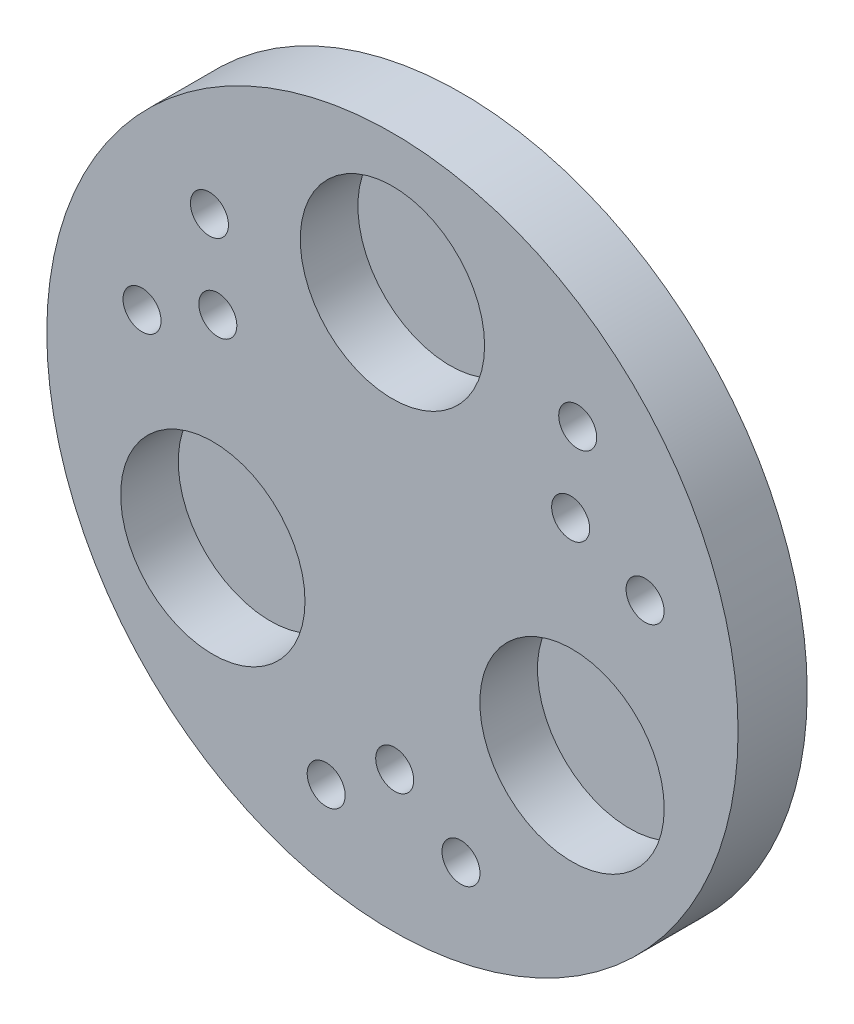
ISO-10303-21;
HEADER;
FILE_DESCRIPTION(('STEP AP214'),'2;1');
FILE_NAME('part.step','',(''),(''),'','','');
FILE_SCHEMA(('AUTOMOTIVE_DESIGN { 1 0 10303 214 1 1 1 1 }'));
ENDSEC;
DATA;
#1=APPLICATION_CONTEXT('core data for automotive mechanical design processes');
#2=APPLICATION_PROTOCOL_DEFINITION('international standard','automotive_design',2000,#1);
#3=PRODUCT_CONTEXT('',#1,'mechanical');
#4=PRODUCT('Part','Part','',(#3));
#5=PRODUCT_RELATED_PRODUCT_CATEGORY('part','',(#4));
#6=PRODUCT_DEFINITION_FORMATION('','',#4);
#7=PRODUCT_DEFINITION_CONTEXT('part definition',#1,'design');
#8=PRODUCT_DEFINITION('design','',#6,#7);
#9=PRODUCT_DEFINITION_SHAPE('','',#8);
#10=(LENGTH_UNIT() NAMED_UNIT(*) SI_UNIT(.MILLI.,.METRE.));
#11=(NAMED_UNIT(*) PLANE_ANGLE_UNIT() SI_UNIT($,.RADIAN.));
#12=(NAMED_UNIT(*) SI_UNIT($,.STERADIAN.) SOLID_ANGLE_UNIT());
#13=UNCERTAINTY_MEASURE_WITH_UNIT(LENGTH_MEASURE(1.E-05),#10,'distance_accuracy_value','');
#14=(GEOMETRIC_REPRESENTATION_CONTEXT(3) GLOBAL_UNCERTAINTY_ASSIGNED_CONTEXT((#13)) GLOBAL_UNIT_ASSIGNED_CONTEXT((#10,
#11,#12)) REPRESENTATION_CONTEXT('',''));
#15=CARTESIAN_POINT('',(0.,0.,0.));
#16=DIRECTION('',(0.,0.,1.));
#17=DIRECTION('',(1.,0.,0.));
#18=AXIS2_PLACEMENT_3D('',#15,#16,#17);
#19=CARTESIAN_POINT('',(0.,0.,2.5));
#20=DIRECTION('',(0.,0.,1.));
#21=DIRECTION('',(1.,0.,0.));
#22=AXIS2_PLACEMENT_3D('',#19,#20,#21);
#23=PLANE('',#22);
#24=CARTESIAN_POINT('',(-5.75102195285126,-21.8579228120305,2.5));
#25=DIRECTION('',(0.,0.,1.));
#26=DIRECTION('',(1.,0.,0.));
#27=AXIS2_PLACEMENT_3D('',#24,#25,#26);
#28=CIRCLE('',#27,1.64999999999999);
#29=CARTESIAN_POINT('',(-4.10102195285127,-21.8579228120305,2.5));
#30=VERTEX_POINT('',#29);
#31=EDGE_CURVE('E45',#30,#30,#28,.T.);
#32=ORIENTED_EDGE('',*,*,#31,.F.);
#33=EDGE_LOOP('',(#32));
#34=FACE_BOUND('',#33,.T.);
#35=CARTESIAN_POINT('',(5.94858039015673,-21.8577727189979,2.5));
#36=DIRECTION('',(0.,0.,1.));
#37=DIRECTION('',(1.,0.,0.));
#38=AXIS2_PLACEMENT_3D('',#35,#36,#37);
#39=CIRCLE('',#38,1.64999999999999);
#40=CARTESIAN_POINT('',(7.59858039015672,-21.8577727189979,2.5));
#41=VERTEX_POINT('',#40);
#42=EDGE_CURVE('E101',#41,#41,#39,.T.);
#43=ORIENTED_EDGE('',*,*,#42,.F.);
#44=EDGE_LOOP('',(#43));
#45=FACE_BOUND('',#44,.T.);
#46=CARTESIAN_POINT('',(21.9301792809536,5.82398866963032,2.5));
#47=DIRECTION('',(0.,0.,1.));
#48=DIRECTION('',(1.,0.,0.));
#49=AXIS2_PLACEMENT_3D('',#46,#47,#48);
#50=CIRCLE('',#49,1.64999999999999);
#51=CARTESIAN_POINT('',(23.5801792809536,5.82398866963032,2.5));
#52=VERTEX_POINT('',#51);
#53=EDGE_CURVE('E96',#52,#52,#50,.T.);
#54=ORIENTED_EDGE('',*,*,#53,.F.);
#55=EDGE_LOOP('',(#54));
#56=FACE_BOUND('',#55,.T.);
#57=CARTESIAN_POINT('',(16.0802481250705,15.9560664663349,2.5));
#58=DIRECTION('',(0.,0.,1.));
#59=DIRECTION('',(1.,0.,0.));
#60=AXIS2_PLACEMENT_3D('',#57,#58,#59);
#61=CIRCLE('',#60,1.64999999999999);
#62=CARTESIAN_POINT('',(17.7302481250704,15.9560664663349,2.5));
#63=VERTEX_POINT('',#62);
#64=EDGE_CURVE('E90',#63,#63,#61,.T.);
#65=ORIENTED_EDGE('',*,*,#64,.F.);
#66=EDGE_LOOP('',(#65));
#67=FACE_BOUND('',#66,.T.);
#68=CARTESIAN_POINT('',(-15.8836599043792,15.9556564045439,2.5));
#69=DIRECTION('',(0.,0.,1.));
#70=DIRECTION('',(1.,0.,0.));
#71=AXIS2_PLACEMENT_3D('',#68,#69,#70);
#72=CIRCLE('',#71,1.64999999999999);
#73=CARTESIAN_POINT('',(-14.2336599043793,15.9556564045439,2.5));
#74=VERTEX_POINT('',#73);
#75=EDGE_CURVE('E84',#74,#74,#72,.T.);
#76=ORIENTED_EDGE('',*,*,#75,.F.);
#77=EDGE_LOOP('',(#76));
#78=FACE_BOUND('',#77,.T.);
#79=CARTESIAN_POINT('',(0.196397149283782,-17.7474115865386,2.5));
#80=DIRECTION('',(0.,0.,1.));
#81=DIRECTION('',(1.,0.,0.));
#82=AXIS2_PLACEMENT_3D('',#79,#80,#81);
#83=CIRCLE('',#82,1.64999999999999);
#84=CARTESIAN_POINT('',(1.84639714928377,-17.7474115865386,2.5));
#85=VERTEX_POINT('',#84);
#86=EDGE_CURVE('E78',#85,#85,#83,.T.);
#87=ORIENTED_EDGE('',*,*,#86,.F.);
#88=EDGE_LOOP('',(#87));
#89=FACE_BOUND('',#88,.T.);
#90=CARTESIAN_POINT('',(15.4679078600027,8.79637912724138,2.5));
#91=DIRECTION('',(0.,0.,1.));
#92=DIRECTION('',(1.,0.,0.));
#93=AXIS2_PLACEMENT_3D('',#90,#91,#92);
#94=CIRCLE('',#93,1.64999999999999);
#95=CARTESIAN_POINT('',(17.1179078600027,8.79637912724138,2.5));
#96=VERTEX_POINT('',#95);
#97=EDGE_CURVE('E72',#96,#96,#94,.T.);
#98=ORIENTED_EDGE('',*,*,#97,.F.);
#99=EDGE_LOOP('',(#98));
#100=FACE_BOUND('',#99,.T.);
#101=CARTESIAN_POINT('',(-15.1554445662277,8.75000000000002,2.5));
#102=DIRECTION('',(0.,0.,1.));
#103=DIRECTION('',(1.,0.,0.));
#104=AXIS2_PLACEMENT_3D('',#101,#102,#103);
#105=CIRCLE('',#104,1.64999999999999);
#106=CARTESIAN_POINT('',(-13.5054445662277,8.75000000000002,2.5));
#107=VERTEX_POINT('',#106);
#108=EDGE_CURVE('E66',#107,#107,#105,.T.);
#109=ORIENTED_EDGE('',*,*,#108,.F.);
#110=EDGE_LOOP('',(#109));
#111=FACE_BOUND('',#110,.T.);
#112=CARTESIAN_POINT('',(-21.733331091504,5.82342851480674,2.5));
#113=DIRECTION('',(0.,0.,1.));
#114=DIRECTION('',(1.,0.,0.));
#115=AXIS2_PLACEMENT_3D('',#112,#113,#114);
#116=CIRCLE('',#115,1.64999999999999);
#117=CARTESIAN_POINT('',(-20.083331091504,5.82342851480674,2.5));
#118=VERTEX_POINT('',#117);
#119=EDGE_CURVE('E60',#118,#118,#116,.T.);
#120=ORIENTED_EDGE('',*,*,#119,.F.);
#121=EDGE_LOOP('',(#120));
#122=FACE_BOUND('',#121,.T.);
#123=CARTESIAN_POINT('',(15.5884572681213,-8.99999999999918,2.5));
#124=DIRECTION('',(0.,0.,1.));
#125=DIRECTION('',(1.,0.,0.));
#126=AXIS2_PLACEMENT_3D('',#123,#124,#125);
#127=CIRCLE('',#126,8.);
#128=CARTESIAN_POINT('',(23.5884572681213,-8.99999999999918,2.5));
#129=VERTEX_POINT('',#128);
#130=EDGE_CURVE('E173',#129,#129,#127,.T.);
#131=ORIENTED_EDGE('',*,*,#130,.F.);
#132=EDGE_LOOP('',(#131));
#133=FACE_BOUND('',#132,.T.);
#134=CARTESIAN_POINT('',(0.,0.,2.5));
#135=DIRECTION('',(0.,0.,1.));
#136=DIRECTION('',(1.,0.,0.));
#137=AXIS2_PLACEMENT_3D('',#134,#135,#136);
#138=CIRCLE('',#137,30.);
#139=CARTESIAN_POINT('',(30.,0.,2.5));
#140=VERTEX_POINT('',#139);
#141=EDGE_CURVE('E10',#140,#140,#138,.T.);
#142=ORIENTED_EDGE('',*,*,#141,.T.);
#143=EDGE_LOOP('',(#142));
#144=FACE_BOUND('',#143,.T.);
#145=CARTESIAN_POINT('',(0.,18.,2.5));
#146=DIRECTION('',(0.,0.,1.));
#147=DIRECTION('',(1.,0.,0.));
#148=AXIS2_PLACEMENT_3D('',#145,#146,#147);
#149=CIRCLE('',#148,8.);
#150=CARTESIAN_POINT('',(8.,18.,2.5));
#151=VERTEX_POINT('',#150);
#152=EDGE_CURVE('E50',#151,#151,#149,.T.);
#153=ORIENTED_EDGE('',*,*,#152,.F.);
#154=EDGE_LOOP('',(#153));
#155=FACE_BOUND('',#154,.T.);
#156=CARTESIAN_POINT('',(-15.5884572681185,-9.00000000000082,2.5));
#157=DIRECTION('',(0.,0.,1.));
#158=DIRECTION('',(1.,0.,0.));
#159=AXIS2_PLACEMENT_3D('',#156,#157,#158);
#160=CIRCLE('',#159,8.);
#161=CARTESIAN_POINT('',(-7.58845726811848,-9.00000000000082,2.5));
#162=VERTEX_POINT('',#161);
#163=EDGE_CURVE('E165',#162,#162,#160,.T.);
#164=ORIENTED_EDGE('',*,*,#163,.F.);
#165=EDGE_LOOP('',(#164));
#166=FACE_BOUND('',#165,.T.);
#167=ADVANCED_FACE('F41',(#34,#45,#56,#67,#78,#89,#100,#111,#122,#133,#144,#155,#166),#23,.T.);
#168=CARTESIAN_POINT('',(0.,0.,2.5));
#169=DIRECTION('',(0.,0.,-1.));
#170=DIRECTION('',(-1.,0.,0.));
#171=AXIS2_PLACEMENT_3D('',#168,#169,#170);
#172=CYLINDRICAL_SURFACE('',#171,30.);
#173=ORIENTED_EDGE('',*,*,#141,.F.);
#174=EDGE_LOOP('',(#173));
#175=FACE_BOUND('',#174,.T.);
#176=CARTESIAN_POINT('',(0.,0.,-3.5));
#177=DIRECTION('',(0.,0.,-1.));
#178=DIRECTION('',(-1.,0.,0.));
#179=AXIS2_PLACEMENT_3D('',#176,#177,#178);
#180=CIRCLE('',#179,30.);
#181=CARTESIAN_POINT('',(-30.,0.,-3.5));
#182=VERTEX_POINT('',#181);
#183=EDGE_CURVE('E64',#182,#182,#180,.T.);
#184=ORIENTED_EDGE('',*,*,#183,.F.);
#185=EDGE_LOOP('',(#184));
#186=FACE_BOUND('',#185,.T.);
#187=ADVANCED_FACE('F43',(#175,#186),#172,.T.);
#188=CARTESIAN_POINT('',(0.,18.,2.5));
#189=DIRECTION('',(0.,0.,-1.));
#190=DIRECTION('',(-1.,0.,0.));
#191=AXIS2_PLACEMENT_3D('',#188,#189,#190);
#192=CYLINDRICAL_SURFACE('',#191,8.);
#193=ORIENTED_EDGE('',*,*,#152,.T.);
#194=EDGE_LOOP('',(#193));
#195=FACE_BOUND('',#194,.T.);
#196=CARTESIAN_POINT('',(0.,18.,-2.5));
#197=DIRECTION('',(0.,0.,1.));
#198=DIRECTION('',(1.,0.,0.));
#199=AXIS2_PLACEMENT_3D('',#196,#197,#198);
#200=CIRCLE('',#199,8.);
#201=CARTESIAN_POINT('',(8.,18.,-2.5));
#202=VERTEX_POINT('',#201);
#203=EDGE_CURVE('E56',#202,#202,#200,.T.);
#204=ORIENTED_EDGE('',*,*,#203,.F.);
#205=EDGE_LOOP('',(#204));
#206=FACE_BOUND('',#205,.T.);
#207=ADVANCED_FACE('F186',(#195,#206),#192,.F.);
#208=CARTESIAN_POINT('',(15.5884572681213,-8.99999999999918,2.5));
#209=DIRECTION('',(0.,0.,-1.));
#210=DIRECTION('',(-1.,0.,0.));
#211=AXIS2_PLACEMENT_3D('',#208,#209,#210);
#212=CYLINDRICAL_SURFACE('',#211,8.);
#213=ORIENTED_EDGE('',*,*,#130,.T.);
#214=EDGE_LOOP('',(#213));
#215=FACE_BOUND('',#214,.T.);
#216=CARTESIAN_POINT('',(15.5884572681213,-8.99999999999918,-2.5));
#217=DIRECTION('',(0.,0.,1.));
#218=DIRECTION('',(1.,0.,0.));
#219=AXIS2_PLACEMENT_3D('',#216,#217,#218);
#220=CIRCLE('',#219,8.);
#221=CARTESIAN_POINT('',(23.5884572681213,-8.99999999999918,-2.5));
#222=VERTEX_POINT('',#221);
#223=EDGE_CURVE('E169',#222,#222,#220,.T.);
#224=ORIENTED_EDGE('',*,*,#223,.F.);
#225=EDGE_LOOP('',(#224));
#226=FACE_BOUND('',#225,.T.);
#227=ADVANCED_FACE('F183',(#215,#226),#212,.F.);
#228=CARTESIAN_POINT('',(-15.5884572681185,-9.00000000000082,2.5));
#229=DIRECTION('',(0.,0.,-1.));
#230=DIRECTION('',(-1.,0.,0.));
#231=AXIS2_PLACEMENT_3D('',#228,#229,#230);
#232=CYLINDRICAL_SURFACE('',#231,8.);
#233=ORIENTED_EDGE('',*,*,#163,.T.);
#234=EDGE_LOOP('',(#233));
#235=FACE_BOUND('',#234,.T.);
#236=CARTESIAN_POINT('',(-15.5884572681185,-9.00000000000082,-2.5));
#237=DIRECTION('',(0.,0.,1.));
#238=DIRECTION('',(1.,0.,0.));
#239=AXIS2_PLACEMENT_3D('',#236,#237,#238);
#240=CIRCLE('',#239,8.);
#241=CARTESIAN_POINT('',(-7.58845726811848,-9.00000000000082,-2.5));
#242=VERTEX_POINT('',#241);
#243=EDGE_CURVE('E164',#242,#242,#240,.T.);
#244=ORIENTED_EDGE('',*,*,#243,.F.);
#245=EDGE_LOOP('',(#244));
#246=FACE_BOUND('',#245,.T.);
#247=ADVANCED_FACE('F185',(#235,#246),#232,.F.);
#248=CARTESIAN_POINT('',(0.,0.,-2.5));
#249=DIRECTION('',(0.,0.,-1.));
#250=DIRECTION('',(-1.,0.,0.));
#251=AXIS2_PLACEMENT_3D('',#248,#249,#250);
#252=PLANE('',#251);
#253=ORIENTED_EDGE('',*,*,#243,.T.);
#254=EDGE_LOOP('',(#253));
#255=FACE_BOUND('',#254,.T.);
#256=ADVANCED_FACE('F193',(#255),#252,.F.);
#257=ORIENTED_EDGE('',*,*,#223,.T.);
#258=EDGE_LOOP('',(#257));
#259=FACE_BOUND('',#258,.T.);
#260=ADVANCED_FACE('F181',(#259),#252,.F.);
#261=ORIENTED_EDGE('',*,*,#203,.T.);
#262=EDGE_LOOP('',(#261));
#263=FACE_BOUND('',#262,.T.);
#264=ADVANCED_FACE('F232',(#263),#252,.F.);
#265=CARTESIAN_POINT('',(0.,0.,-3.5));
#266=DIRECTION('',(0.,0.,-1.));
#267=DIRECTION('',(-1.,0.,0.));
#268=AXIS2_PLACEMENT_3D('',#265,#266,#267);
#269=PLANE('',#268);
#270=CARTESIAN_POINT('',(-5.75102195285126,-21.8579228120305,-3.5));
#271=DIRECTION('',(0.,0.,-1.));
#272=DIRECTION('',(-1.,0.,0.));
#273=AXIS2_PLACEMENT_3D('',#270,#271,#272);
#274=CIRCLE('',#273,2.025);
#275=CARTESIAN_POINT('',(-7.77602195285126,-21.8579228120305,-3.5));
#276=VERTEX_POINT('',#275);
#277=EDGE_CURVE('E330',#276,#276,#274,.T.);
#278=ORIENTED_EDGE('',*,*,#277,.F.);
#279=EDGE_LOOP('',(#278));
#280=FACE_BOUND('',#279,.T.);
#281=CARTESIAN_POINT('',(5.94858039015673,-21.8577727189979,-3.5));
#282=DIRECTION('',(0.,0.,-1.));
#283=DIRECTION('',(-1.,0.,0.));
#284=AXIS2_PLACEMENT_3D('',#281,#282,#283);
#285=CIRCLE('',#284,2.025);
#286=CARTESIAN_POINT('',(3.92358039015673,-21.8577727189979,-3.5));
#287=VERTEX_POINT('',#286);
#288=EDGE_CURVE('E113',#287,#287,#285,.T.);
#289=ORIENTED_EDGE('',*,*,#288,.F.);
#290=EDGE_LOOP('',(#289));
#291=FACE_BOUND('',#290,.T.);
#292=CARTESIAN_POINT('',(21.9301792809536,5.82398866963032,-3.5));
#293=DIRECTION('',(0.,0.,-1.));
#294=DIRECTION('',(-1.,0.,0.));
#295=AXIS2_PLACEMENT_3D('',#292,#293,#294);
#296=CIRCLE('',#295,2.025);
#297=CARTESIAN_POINT('',(19.9051792809536,5.82398866963032,-3.5));
#298=VERTEX_POINT('',#297);
#299=EDGE_CURVE('E104',#298,#298,#296,.T.);
#300=ORIENTED_EDGE('',*,*,#299,.F.);
#301=EDGE_LOOP('',(#300));
#302=FACE_BOUND('',#301,.T.);
#303=CARTESIAN_POINT('',(16.0802481250705,15.9560664663349,-3.5));
#304=DIRECTION('',(0.,0.,-1.));
#305=DIRECTION('',(-1.,0.,0.));
#306=AXIS2_PLACEMENT_3D('',#303,#304,#305);
#307=CIRCLE('',#306,2.025);
#308=CARTESIAN_POINT('',(14.0552481250705,15.9560664663349,-3.5));
#309=VERTEX_POINT('',#308);
#310=EDGE_CURVE('E99',#309,#309,#307,.T.);
#311=ORIENTED_EDGE('',*,*,#310,.F.);
#312=EDGE_LOOP('',(#311));
#313=FACE_BOUND('',#312,.T.);
#314=CARTESIAN_POINT('',(-15.8836599043792,15.9556564045439,-3.5));
#315=DIRECTION('',(0.,0.,-1.));
#316=DIRECTION('',(-1.,0.,0.));
#317=AXIS2_PLACEMENT_3D('',#314,#315,#316);
#318=CIRCLE('',#317,2.025);
#319=CARTESIAN_POINT('',(-17.9086599043792,15.9556564045439,-3.5));
#320=VERTEX_POINT('',#319);
#321=EDGE_CURVE('E94',#320,#320,#318,.T.);
#322=ORIENTED_EDGE('',*,*,#321,.F.);
#323=EDGE_LOOP('',(#322));
#324=FACE_BOUND('',#323,.T.);
#325=CARTESIAN_POINT('',(0.196397149283782,-17.7474115865386,-3.5));
#326=DIRECTION('',(0.,0.,-1.));
#327=DIRECTION('',(-1.,0.,0.));
#328=AXIS2_PLACEMENT_3D('',#325,#326,#327);
#329=CIRCLE('',#328,2.025);
#330=CARTESIAN_POINT('',(-1.82860285071622,-17.7474115865386,-3.5));
#331=VERTEX_POINT('',#330);
#332=EDGE_CURVE('E88',#331,#331,#329,.T.);
#333=ORIENTED_EDGE('',*,*,#332,.F.);
#334=EDGE_LOOP('',(#333));
#335=FACE_BOUND('',#334,.T.);
#336=CARTESIAN_POINT('',(15.4679078600027,8.79637912724138,-3.5));
#337=DIRECTION('',(0.,0.,-1.));
#338=DIRECTION('',(-1.,0.,0.));
#339=AXIS2_PLACEMENT_3D('',#336,#337,#338);
#340=CIRCLE('',#339,2.025);
#341=CARTESIAN_POINT('',(13.4429078600027,8.79637912724138,-3.5));
#342=VERTEX_POINT('',#341);
#343=EDGE_CURVE('E82',#342,#342,#340,.T.);
#344=ORIENTED_EDGE('',*,*,#343,.F.);
#345=EDGE_LOOP('',(#344));
#346=FACE_BOUND('',#345,.T.);
#347=CARTESIAN_POINT('',(-15.1554445662277,8.75000000000002,-3.5));
#348=DIRECTION('',(0.,0.,-1.));
#349=DIRECTION('',(-1.,0.,0.));
#350=AXIS2_PLACEMENT_3D('',#347,#348,#349);
#351=CIRCLE('',#350,2.025);
#352=CARTESIAN_POINT('',(-17.1804445662277,8.75000000000002,-3.5));
#353=VERTEX_POINT('',#352);
#354=EDGE_CURVE('E76',#353,#353,#351,.T.);
#355=ORIENTED_EDGE('',*,*,#354,.F.);
#356=EDGE_LOOP('',(#355));
#357=FACE_BOUND('',#356,.T.);
#358=CARTESIAN_POINT('',(-21.733331091504,5.82342851480674,-3.5));
#359=DIRECTION('',(0.,0.,-1.));
#360=DIRECTION('',(-1.,0.,0.));
#361=AXIS2_PLACEMENT_3D('',#358,#359,#360);
#362=CIRCLE('',#361,2.025);
#363=CARTESIAN_POINT('',(-23.758331091504,5.82342851480674,-3.5));
#364=VERTEX_POINT('',#363);
#365=EDGE_CURVE('E70',#364,#364,#362,.T.);
#366=ORIENTED_EDGE('',*,*,#365,.F.);
#367=EDGE_LOOP('',(#366));
#368=FACE_BOUND('',#367,.T.);
#369=ORIENTED_EDGE('',*,*,#183,.T.);
#370=EDGE_LOOP('',(#369));
#371=FACE_BOUND('',#370,.T.);
#372=ADVANCED_FACE('F238',(#280,#291,#302,#313,#324,#335,#346,#357,#368,#371),#269,.T.);
#373=CARTESIAN_POINT('',(-21.733331091504,5.82342851480674,-3.5));
#374=DIRECTION('',(0.,0.,-1.));
#375=DIRECTION('',(-1.,0.,0.));
#376=AXIS2_PLACEMENT_3D('',#373,#374,#375);
#377=CYLINDRICAL_SURFACE('',#376,1.64999999999999);
#378=ORIENTED_EDGE('',*,*,#119,.T.);
#379=EDGE_LOOP('',(#378));
#380=FACE_BOUND('',#379,.T.);
#381=CARTESIAN_POINT('',(-21.733331091504,5.82342851480674,-3.125));
#382=DIRECTION('',(0.,0.,-1.));
#383=DIRECTION('',(-1.,0.,0.));
#384=AXIS2_PLACEMENT_3D('',#381,#382,#383);
#385=CIRCLE('',#384,1.64999999999999);
#386=CARTESIAN_POINT('',(-23.383331091504,5.82342851480674,-3.125));
#387=VERTEX_POINT('',#386);
#388=EDGE_CURVE('E65',#387,#387,#385,.T.);
#389=ORIENTED_EDGE('',*,*,#388,.T.);
#390=EDGE_LOOP('',(#389));
#391=FACE_BOUND('',#390,.T.);
#392=ADVANCED_FACE('F243',(#380,#391),#377,.F.);
#393=CARTESIAN_POINT('',(-21.733331091504,5.82342851480674,-3.5));
#394=DIRECTION('',(0.,0.,-1.));
#395=DIRECTION('',(-1.,0.,0.));
#396=AXIS2_PLACEMENT_3D('',#393,#394,#395);
#397=CONICAL_SURFACE('',#396,2.025,0.785398163397455);
#398=ORIENTED_EDGE('',*,*,#388,.F.);
#399=EDGE_LOOP('',(#398));
#400=FACE_BOUND('',#399,.T.);
#401=ORIENTED_EDGE('',*,*,#365,.T.);
#402=EDGE_LOOP('',(#401));
#403=FACE_BOUND('',#402,.T.);
#404=ADVANCED_FACE('F252',(#400,#403),#397,.F.);
#405=CARTESIAN_POINT('',(-15.1554445662277,8.75000000000002,-3.5));
#406=DIRECTION('',(0.,0.,-1.));
#407=DIRECTION('',(-1.,0.,0.));
#408=AXIS2_PLACEMENT_3D('',#405,#406,#407);
#409=CYLINDRICAL_SURFACE('',#408,1.64999999999999);
#410=ORIENTED_EDGE('',*,*,#108,.T.);
#411=EDGE_LOOP('',(#410));
#412=FACE_BOUND('',#411,.T.);
#413=CARTESIAN_POINT('',(-15.1554445662277,8.75000000000002,-3.125));
#414=DIRECTION('',(0.,0.,-1.));
#415=DIRECTION('',(-1.,0.,0.));
#416=AXIS2_PLACEMENT_3D('',#413,#414,#415);
#417=CIRCLE('',#416,1.64999999999999);
#418=CARTESIAN_POINT('',(-16.8054445662277,8.75000000000002,-3.125));
#419=VERTEX_POINT('',#418);
#420=EDGE_CURVE('E71',#419,#419,#417,.T.);
#421=ORIENTED_EDGE('',*,*,#420,.T.);
#422=EDGE_LOOP('',(#421));
#423=FACE_BOUND('',#422,.T.);
#424=ADVANCED_FACE('F260',(#412,#423),#409,.F.);
#425=CARTESIAN_POINT('',(-15.1554445662277,8.75000000000002,-3.5));
#426=DIRECTION('',(0.,0.,-1.));
#427=DIRECTION('',(-1.,0.,0.));
#428=AXIS2_PLACEMENT_3D('',#425,#426,#427);
#429=CONICAL_SURFACE('',#428,2.025,0.785398163397458);
#430=ORIENTED_EDGE('',*,*,#420,.F.);
#431=EDGE_LOOP('',(#430));
#432=FACE_BOUND('',#431,.T.);
#433=ORIENTED_EDGE('',*,*,#354,.T.);
#434=EDGE_LOOP('',(#433));
#435=FACE_BOUND('',#434,.T.);
#436=ADVANCED_FACE('F264',(#432,#435),#429,.F.);
#437=CARTESIAN_POINT('',(15.4679078600027,8.79637912724138,-3.5));
#438=DIRECTION('',(0.,0.,-1.));
#439=DIRECTION('',(-1.,0.,0.));
#440=AXIS2_PLACEMENT_3D('',#437,#438,#439);
#441=CYLINDRICAL_SURFACE('',#440,1.64999999999999);
#442=ORIENTED_EDGE('',*,*,#97,.T.);
#443=EDGE_LOOP('',(#442));
#444=FACE_BOUND('',#443,.T.);
#445=CARTESIAN_POINT('',(15.4679078600027,8.79637912724138,-3.125));
#446=DIRECTION('',(0.,0.,-1.));
#447=DIRECTION('',(-1.,0.,0.));
#448=AXIS2_PLACEMENT_3D('',#445,#446,#447);
#449=CIRCLE('',#448,1.64999999999999);
#450=CARTESIAN_POINT('',(13.8179078600028,8.79637912724138,-3.125));
#451=VERTEX_POINT('',#450);
#452=EDGE_CURVE('E77',#451,#451,#449,.T.);
#453=ORIENTED_EDGE('',*,*,#452,.T.);
#454=EDGE_LOOP('',(#453));
#455=FACE_BOUND('',#454,.T.);
#456=ADVANCED_FACE('F268',(#444,#455),#441,.F.);
#457=CARTESIAN_POINT('',(15.4679078600027,8.79637912724138,-3.5));
#458=DIRECTION('',(0.,0.,-1.));
#459=DIRECTION('',(-1.,0.,0.));
#460=AXIS2_PLACEMENT_3D('',#457,#458,#459);
#461=CONICAL_SURFACE('',#460,2.025,0.785398163397455);
#462=ORIENTED_EDGE('',*,*,#452,.F.);
#463=EDGE_LOOP('',(#462));
#464=FACE_BOUND('',#463,.T.);
#465=ORIENTED_EDGE('',*,*,#343,.T.);
#466=EDGE_LOOP('',(#465));
#467=FACE_BOUND('',#466,.T.);
#468=ADVANCED_FACE('F272',(#464,#467),#461,.F.);
#469=CARTESIAN_POINT('',(0.196397149283782,-17.7474115865386,-3.5));
#470=DIRECTION('',(0.,0.,-1.));
#471=DIRECTION('',(-1.,0.,0.));
#472=AXIS2_PLACEMENT_3D('',#469,#470,#471);
#473=CYLINDRICAL_SURFACE('',#472,1.64999999999999);
#474=ORIENTED_EDGE('',*,*,#86,.T.);
#475=EDGE_LOOP('',(#474));
#476=FACE_BOUND('',#475,.T.);
#477=CARTESIAN_POINT('',(0.196397149283782,-17.7474115865386,-3.125));
#478=DIRECTION('',(0.,0.,-1.));
#479=DIRECTION('',(-1.,0.,0.));
#480=AXIS2_PLACEMENT_3D('',#477,#478,#479);
#481=CIRCLE('',#480,1.64999999999999);
#482=CARTESIAN_POINT('',(-1.45360285071621,-17.7474115865386,-3.125));
#483=VERTEX_POINT('',#482);
#484=EDGE_CURVE('E83',#483,#483,#481,.T.);
#485=ORIENTED_EDGE('',*,*,#484,.T.);
#486=EDGE_LOOP('',(#485));
#487=FACE_BOUND('',#486,.T.);
#488=ADVANCED_FACE('F276',(#476,#487),#473,.F.);
#489=CARTESIAN_POINT('',(0.196397149283782,-17.7474115865386,-3.5));
#490=DIRECTION('',(0.,0.,-1.));
#491=DIRECTION('',(-1.,0.,0.));
#492=AXIS2_PLACEMENT_3D('',#489,#490,#491);
#493=CONICAL_SURFACE('',#492,2.025,0.785398163397458);
#494=ORIENTED_EDGE('',*,*,#484,.F.);
#495=EDGE_LOOP('',(#494));
#496=FACE_BOUND('',#495,.T.);
#497=ORIENTED_EDGE('',*,*,#332,.T.);
#498=EDGE_LOOP('',(#497));
#499=FACE_BOUND('',#498,.T.);
#500=ADVANCED_FACE('F280',(#496,#499),#493,.F.);
#501=CARTESIAN_POINT('',(-15.8836599043792,15.9556564045439,-3.5));
#502=DIRECTION('',(0.,0.,-1.));
#503=DIRECTION('',(-1.,0.,0.));
#504=AXIS2_PLACEMENT_3D('',#501,#502,#503);
#505=CYLINDRICAL_SURFACE('',#504,1.64999999999999);
#506=ORIENTED_EDGE('',*,*,#75,.T.);
#507=EDGE_LOOP('',(#506));
#508=FACE_BOUND('',#507,.T.);
#509=CARTESIAN_POINT('',(-15.8836599043792,15.9556564045439,-3.125));
#510=DIRECTION('',(0.,0.,-1.));
#511=DIRECTION('',(-1.,0.,0.));
#512=AXIS2_PLACEMENT_3D('',#509,#510,#511);
#513=CIRCLE('',#512,1.64999999999999);
#514=CARTESIAN_POINT('',(-17.5336599043792,15.9556564045439,-3.125));
#515=VERTEX_POINT('',#514);
#516=EDGE_CURVE('E89',#515,#515,#513,.T.);
#517=ORIENTED_EDGE('',*,*,#516,.T.);
#518=EDGE_LOOP('',(#517));
#519=FACE_BOUND('',#518,.T.);
#520=ADVANCED_FACE('F284',(#508,#519),#505,.F.);
#521=CARTESIAN_POINT('',(-15.8836599043792,15.9556564045439,-3.5));
#522=DIRECTION('',(0.,0.,-1.));
#523=DIRECTION('',(-1.,0.,0.));
#524=AXIS2_PLACEMENT_3D('',#521,#522,#523);
#525=CONICAL_SURFACE('',#524,2.025,0.785398163397458);
#526=ORIENTED_EDGE('',*,*,#516,.F.);
#527=EDGE_LOOP('',(#526));
#528=FACE_BOUND('',#527,.T.);
#529=ORIENTED_EDGE('',*,*,#321,.T.);
#530=EDGE_LOOP('',(#529));
#531=FACE_BOUND('',#530,.T.);
#532=ADVANCED_FACE('F288',(#528,#531),#525,.F.);
#533=CARTESIAN_POINT('',(16.0802481250705,15.9560664663349,-3.5));
#534=DIRECTION('',(0.,0.,-1.));
#535=DIRECTION('',(-1.,0.,0.));
#536=AXIS2_PLACEMENT_3D('',#533,#534,#535);
#537=CYLINDRICAL_SURFACE('',#536,1.64999999999999);
#538=ORIENTED_EDGE('',*,*,#64,.T.);
#539=EDGE_LOOP('',(#538));
#540=FACE_BOUND('',#539,.T.);
#541=CARTESIAN_POINT('',(16.0802481250705,15.9560664663349,-3.125));
#542=DIRECTION('',(0.,0.,-1.));
#543=DIRECTION('',(-1.,0.,0.));
#544=AXIS2_PLACEMENT_3D('',#541,#542,#543);
#545=CIRCLE('',#544,1.64999999999999);
#546=CARTESIAN_POINT('',(14.4302481250705,15.9560664663349,-3.125));
#547=VERTEX_POINT('',#546);
#548=EDGE_CURVE('E95',#547,#547,#545,.T.);
#549=ORIENTED_EDGE('',*,*,#548,.T.);
#550=EDGE_LOOP('',(#549));
#551=FACE_BOUND('',#550,.T.);
#552=ADVANCED_FACE('F292',(#540,#551),#537,.F.);
#553=CARTESIAN_POINT('',(16.0802481250705,15.9560664663349,-3.5));
#554=DIRECTION('',(0.,0.,-1.));
#555=DIRECTION('',(-1.,0.,0.));
#556=AXIS2_PLACEMENT_3D('',#553,#554,#555);
#557=CONICAL_SURFACE('',#556,2.025,0.785398163397455);
#558=ORIENTED_EDGE('',*,*,#548,.F.);
#559=EDGE_LOOP('',(#558));
#560=FACE_BOUND('',#559,.T.);
#561=ORIENTED_EDGE('',*,*,#310,.T.);
#562=EDGE_LOOP('',(#561));
#563=FACE_BOUND('',#562,.T.);
#564=ADVANCED_FACE('F296',(#560,#563),#557,.F.);
#565=CARTESIAN_POINT('',(21.9301792809536,5.82398866963032,-3.5));
#566=DIRECTION('',(0.,0.,-1.));
#567=DIRECTION('',(-1.,0.,0.));
#568=AXIS2_PLACEMENT_3D('',#565,#566,#567);
#569=CYLINDRICAL_SURFACE('',#568,1.64999999999999);
#570=ORIENTED_EDGE('',*,*,#53,.T.);
#571=EDGE_LOOP('',(#570));
#572=FACE_BOUND('',#571,.T.);
#573=CARTESIAN_POINT('',(21.9301792809536,5.82398866963032,-3.125));
#574=DIRECTION('',(0.,0.,-1.));
#575=DIRECTION('',(-1.,0.,0.));
#576=AXIS2_PLACEMENT_3D('',#573,#574,#575);
#577=CIRCLE('',#576,1.64999999999999);
#578=CARTESIAN_POINT('',(20.2801792809536,5.82398866963032,-3.125));
#579=VERTEX_POINT('',#578);
#580=EDGE_CURVE('E100',#579,#579,#577,.T.);
#581=ORIENTED_EDGE('',*,*,#580,.T.);
#582=EDGE_LOOP('',(#581));
#583=FACE_BOUND('',#582,.T.);
#584=ADVANCED_FACE('F300',(#572,#583),#569,.F.);
#585=CARTESIAN_POINT('',(21.9301792809536,5.82398866963032,-3.5));
#586=DIRECTION('',(0.,0.,-1.));
#587=DIRECTION('',(-1.,0.,0.));
#588=AXIS2_PLACEMENT_3D('',#585,#586,#587);
#589=CONICAL_SURFACE('',#588,2.025,0.785398163397455);
#590=ORIENTED_EDGE('',*,*,#580,.F.);
#591=EDGE_LOOP('',(#590));
#592=FACE_BOUND('',#591,.T.);
#593=ORIENTED_EDGE('',*,*,#299,.T.);
#594=EDGE_LOOP('',(#593));
#595=FACE_BOUND('',#594,.T.);
#596=ADVANCED_FACE('F304',(#592,#595),#589,.F.);
#597=CARTESIAN_POINT('',(5.94858039015673,-21.8577727189979,-3.5));
#598=DIRECTION('',(0.,0.,-1.));
#599=DIRECTION('',(-1.,0.,0.));
#600=AXIS2_PLACEMENT_3D('',#597,#598,#599);
#601=CYLINDRICAL_SURFACE('',#600,1.64999999999999);
#602=ORIENTED_EDGE('',*,*,#42,.T.);
#603=EDGE_LOOP('',(#602));
#604=FACE_BOUND('',#603,.T.);
#605=CARTESIAN_POINT('',(5.94858039015673,-21.8577727189979,-3.125));
#606=DIRECTION('',(0.,0.,-1.));
#607=DIRECTION('',(-1.,0.,0.));
#608=AXIS2_PLACEMENT_3D('',#605,#606,#607);
#609=CIRCLE('',#608,1.64999999999999);
#610=CARTESIAN_POINT('',(4.29858039015674,-21.8577727189979,-3.125));
#611=VERTEX_POINT('',#610);
#612=EDGE_CURVE('E105',#611,#611,#609,.T.);
#613=ORIENTED_EDGE('',*,*,#612,.T.);
#614=EDGE_LOOP('',(#613));
#615=FACE_BOUND('',#614,.T.);
#616=ADVANCED_FACE('F308',(#604,#615),#601,.F.);
#617=CARTESIAN_POINT('',(5.94858039015673,-21.8577727189979,-3.5));
#618=DIRECTION('',(0.,0.,-1.));
#619=DIRECTION('',(-1.,0.,0.));
#620=AXIS2_PLACEMENT_3D('',#617,#618,#619);
#621=CONICAL_SURFACE('',#620,2.025,0.785398163397458);
#622=ORIENTED_EDGE('',*,*,#612,.F.);
#623=EDGE_LOOP('',(#622));
#624=FACE_BOUND('',#623,.T.);
#625=ORIENTED_EDGE('',*,*,#288,.T.);
#626=EDGE_LOOP('',(#625));
#627=FACE_BOUND('',#626,.T.);
#628=ADVANCED_FACE('F312',(#624,#627),#621,.F.);
#629=CARTESIAN_POINT('',(-5.75102195285126,-21.8579228120305,-3.5));
#630=DIRECTION('',(0.,0.,-1.));
#631=DIRECTION('',(-1.,0.,0.));
#632=AXIS2_PLACEMENT_3D('',#629,#630,#631);
#633=CYLINDRICAL_SURFACE('',#632,1.64999999999999);
#634=ORIENTED_EDGE('',*,*,#31,.T.);
#635=EDGE_LOOP('',(#634));
#636=FACE_BOUND('',#635,.T.);
#637=CARTESIAN_POINT('',(-5.75102195285126,-21.8579228120305,-3.125));
#638=DIRECTION('',(0.,0.,-1.));
#639=DIRECTION('',(-1.,0.,0.));
#640=AXIS2_PLACEMENT_3D('',#637,#638,#639);
#641=CIRCLE('',#640,1.64999999999999);
#642=CARTESIAN_POINT('',(-7.40102195285125,-21.8579228120305,-3.125));
#643=VERTEX_POINT('',#642);
#644=EDGE_CURVE('E328',#643,#643,#641,.T.);
#645=ORIENTED_EDGE('',*,*,#644,.T.);
#646=EDGE_LOOP('',(#645));
#647=FACE_BOUND('',#646,.T.);
#648=ADVANCED_FACE('F315',(#636,#647),#633,.F.);
#649=CARTESIAN_POINT('',(-5.75102195285126,-21.8579228120305,-3.5));
#650=DIRECTION('',(0.,0.,-1.));
#651=DIRECTION('',(-1.,0.,0.));
#652=AXIS2_PLACEMENT_3D('',#649,#650,#651);
#653=CONICAL_SURFACE('',#652,2.025,0.785398163397458);
#654=ORIENTED_EDGE('',*,*,#644,.F.);
#655=EDGE_LOOP('',(#654));
#656=FACE_BOUND('',#655,.T.);
#657=ORIENTED_EDGE('',*,*,#277,.T.);
#658=EDGE_LOOP('',(#657));
#659=FACE_BOUND('',#658,.T.);
#660=ADVANCED_FACE('F319',(#656,#659),#653,.F.);
#661=CLOSED_SHELL('',(#167,#187,#207,#227,#247,#256,#260,#264,#372,#392,#404,#424,#436,#456,
#468,#488,#500,#520,#532,#552,#564,#584,#596,#616,#628,#648,#660));
#662=MANIFOLD_SOLID_BREP('B2',#661);
#663=ADVANCED_BREP_SHAPE_REPRESENTATION('',(#18,#662),#14);
#664=SHAPE_DEFINITION_REPRESENTATION(#9,#663);
ENDSEC;
END-ISO-10303-21;
